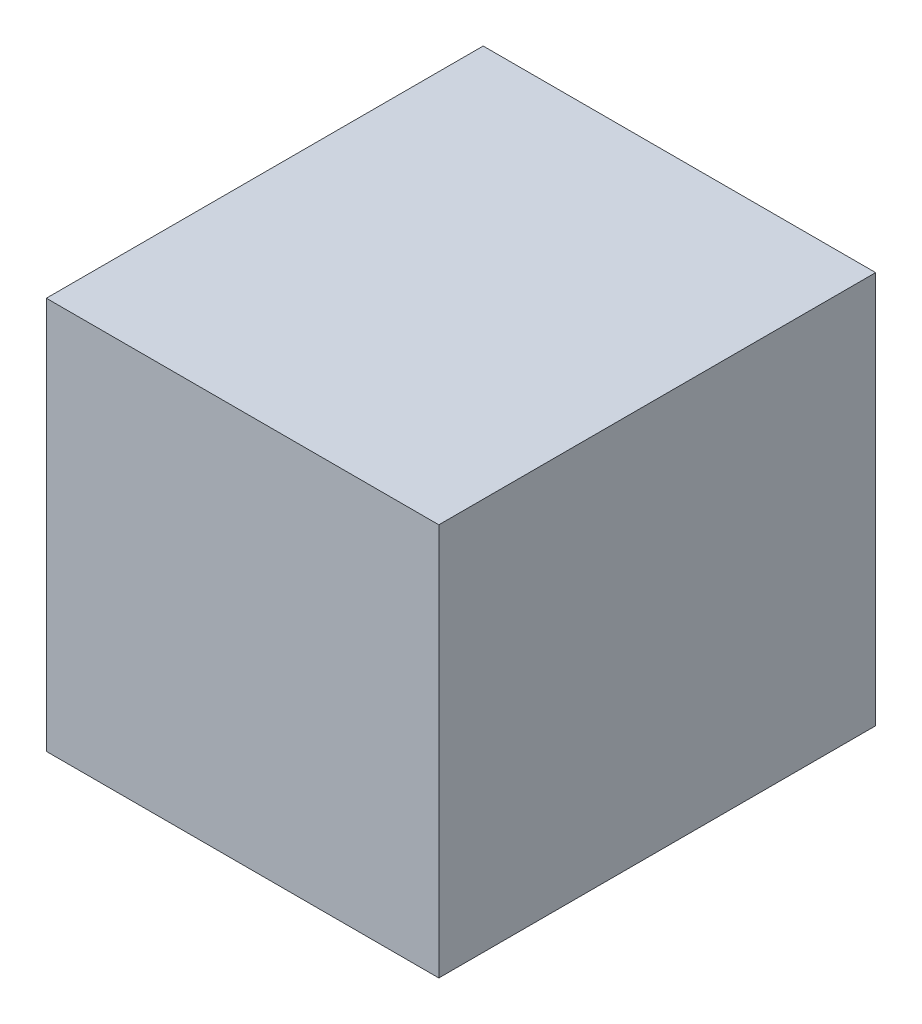
ISO-10303-21;
HEADER;
FILE_DESCRIPTION(('STEP AP214'),'2;1');
FILE_NAME('part.step','',(''),(''),'','','');
FILE_SCHEMA(('AUTOMOTIVE_DESIGN { 1 0 10303 214 1 1 1 1 }'));
ENDSEC;
DATA;
#1=APPLICATION_CONTEXT('core data for automotive mechanical design processes');
#2=APPLICATION_PROTOCOL_DEFINITION('international standard','automotive_design',2000,#1);
#3=PRODUCT_CONTEXT('',#1,'mechanical');
#4=PRODUCT('Part','Part','',(#3));
#5=PRODUCT_RELATED_PRODUCT_CATEGORY('part','',(#4));
#6=PRODUCT_DEFINITION_FORMATION('','',#4);
#7=PRODUCT_DEFINITION_CONTEXT('part definition',#1,'design');
#8=PRODUCT_DEFINITION('design','',#6,#7);
#9=PRODUCT_DEFINITION_SHAPE('','',#8);
#10=(LENGTH_UNIT() NAMED_UNIT(*) SI_UNIT(.MILLI.,.METRE.));
#11=(NAMED_UNIT(*) PLANE_ANGLE_UNIT() SI_UNIT($,.RADIAN.));
#12=(NAMED_UNIT(*) SI_UNIT($,.STERADIAN.) SOLID_ANGLE_UNIT());
#13=UNCERTAINTY_MEASURE_WITH_UNIT(LENGTH_MEASURE(1.E-05),#10,'distance_accuracy_value','');
#14=(GEOMETRIC_REPRESENTATION_CONTEXT(3) GLOBAL_UNCERTAINTY_ASSIGNED_CONTEXT((#13)) GLOBAL_UNIT_ASSIGNED_CONTEXT((#10,
#11,#12)) REPRESENTATION_CONTEXT('',''));
#15=CARTESIAN_POINT('',(0.,0.,0.));
#16=DIRECTION('',(0.,0.,1.));
#17=DIRECTION('',(1.,0.,0.));
#18=AXIS2_PLACEMENT_3D('',#15,#16,#17);
#19=CARTESIAN_POINT('',(44.958,-44.958,100.076));
#20=DIRECTION('',(-1.,0.,0.));
#21=DIRECTION('',(0.,0.,1.));
#22=AXIS2_PLACEMENT_3D('',#19,#20,#21);
#23=PLANE('',#22);
#24=DIRECTION('',(0.,1.,0.));
#25=VECTOR('',#24,1.);
#26=CARTESIAN_POINT('',(44.958,-44.958,0.));
#27=LINE('',#26,#25);
#28=CARTESIAN_POINT('',(44.958,-44.958,0.));
#29=VERTEX_POINT('',#28);
#30=CARTESIAN_POINT('',(44.958,44.958,0.));
#31=VERTEX_POINT('',#30);
#32=EDGE_CURVE('E105',#29,#31,#27,.T.);
#33=ORIENTED_EDGE('',*,*,#32,.T.);
#34=DIRECTION('',(0.,0.,-1.));
#35=VECTOR('',#34,1.);
#36=CARTESIAN_POINT('',(44.958,44.958,100.076));
#37=LINE('',#36,#35);
#38=CARTESIAN_POINT('',(44.958,44.958,100.076));
#39=VERTEX_POINT('',#38);
#40=EDGE_CURVE('E11',#39,#31,#37,.T.);
#41=ORIENTED_EDGE('',*,*,#40,.F.);
#42=DIRECTION('',(0.,1.,0.));
#43=VECTOR('',#42,1.);
#44=CARTESIAN_POINT('',(44.958,-44.958,100.076));
#45=LINE('',#44,#43);
#46=CARTESIAN_POINT('',(44.958,-44.958,100.076));
#47=VERTEX_POINT('',#46);
#48=EDGE_CURVE('E93',#47,#39,#45,.T.);
#49=ORIENTED_EDGE('',*,*,#48,.F.);
#50=DIRECTION('',(0.,0.,-1.));
#51=VECTOR('',#50,1.);
#52=CARTESIAN_POINT('',(44.958,-44.958,100.076));
#53=LINE('',#52,#51);
#54=EDGE_CURVE('E101',#47,#29,#53,.T.);
#55=ORIENTED_EDGE('',*,*,#54,.T.);
#56=EDGE_LOOP('',(#33,#41,#49,#55));
#57=FACE_BOUND('',#56,.T.);
#58=ADVANCED_FACE('F42',(#57),#23,.F.);
#59=CARTESIAN_POINT('',(-44.958,44.958,100.076));
#60=DIRECTION('',(0.,-1.,0.));
#61=DIRECTION('',(0.,0.,-1.));
#62=AXIS2_PLACEMENT_3D('',#59,#60,#61);
#63=PLANE('',#62);
#64=DIRECTION('',(-1.,0.,0.));
#65=VECTOR('',#64,1.);
#66=CARTESIAN_POINT('',(-44.958,44.958,0.));
#67=LINE('',#66,#65);
#68=CARTESIAN_POINT('',(-44.958,44.958,0.));
#69=VERTEX_POINT('',#68);
#70=EDGE_CURVE('E97',#31,#69,#67,.T.);
#71=ORIENTED_EDGE('',*,*,#70,.T.);
#72=DIRECTION('',(0.,0.,-1.));
#73=VECTOR('',#72,1.);
#74=CARTESIAN_POINT('',(-44.958,44.958,100.076));
#75=LINE('',#74,#73);
#76=CARTESIAN_POINT('',(-44.958,44.958,100.076));
#77=VERTEX_POINT('',#76);
#78=EDGE_CURVE('E50',#77,#69,#75,.T.);
#79=ORIENTED_EDGE('',*,*,#78,.F.);
#80=DIRECTION('',(-1.,0.,0.));
#81=VECTOR('',#80,1.);
#82=CARTESIAN_POINT('',(-44.958,44.958,100.076));
#83=LINE('',#82,#81);
#84=EDGE_CURVE('E88',#39,#77,#83,.T.);
#85=ORIENTED_EDGE('',*,*,#84,.F.);
#86=ORIENTED_EDGE('',*,*,#40,.T.);
#87=EDGE_LOOP('',(#71,#79,#85,#86));
#88=FACE_BOUND('',#87,.T.);
#89=ADVANCED_FACE('F96',(#88),#63,.F.);
#90=CARTESIAN_POINT('',(-44.958,-44.958,100.076));
#91=DIRECTION('',(1.,0.,0.));
#92=DIRECTION('',(0.,0.,-1.));
#93=AXIS2_PLACEMENT_3D('',#90,#91,#92);
#94=PLANE('',#93);
#95=DIRECTION('',(0.,-1.,0.));
#96=VECTOR('',#95,1.);
#97=CARTESIAN_POINT('',(-44.958,-44.958,0.));
#98=LINE('',#97,#96);
#99=CARTESIAN_POINT('',(-44.958,-44.958,0.));
#100=VERTEX_POINT('',#99);
#101=EDGE_CURVE('E75',#69,#100,#98,.T.);
#102=ORIENTED_EDGE('',*,*,#101,.T.);
#103=DIRECTION('',(0.,0.,-1.));
#104=VECTOR('',#103,1.);
#105=CARTESIAN_POINT('',(-44.958,-44.958,100.076));
#106=LINE('',#105,#104);
#107=CARTESIAN_POINT('',(-44.958,-44.958,100.076));
#108=VERTEX_POINT('',#107);
#109=EDGE_CURVE('E98',#108,#100,#106,.T.);
#110=ORIENTED_EDGE('',*,*,#109,.F.);
#111=DIRECTION('',(0.,-1.,0.));
#112=VECTOR('',#111,1.);
#113=CARTESIAN_POINT('',(-44.958,-44.958,100.076));
#114=LINE('',#113,#112);
#115=EDGE_CURVE('E91',#77,#108,#114,.T.);
#116=ORIENTED_EDGE('',*,*,#115,.F.);
#117=ORIENTED_EDGE('',*,*,#78,.T.);
#118=EDGE_LOOP('',(#102,#110,#116,#117));
#119=FACE_BOUND('',#118,.T.);
#120=ADVANCED_FACE('F99',(#119),#94,.F.);
#121=CARTESIAN_POINT('',(-44.958,-44.958,100.076));
#122=DIRECTION('',(0.,1.,0.));
#123=DIRECTION('',(0.,0.,1.));
#124=AXIS2_PLACEMENT_3D('',#121,#122,#123);
#125=PLANE('',#124);
#126=DIRECTION('',(1.,0.,0.));
#127=VECTOR('',#126,1.);
#128=CARTESIAN_POINT('',(-44.958,-44.958,0.));
#129=LINE('',#128,#127);
#130=EDGE_CURVE('E81',#100,#29,#129,.T.);
#131=ORIENTED_EDGE('',*,*,#130,.T.);
#132=ORIENTED_EDGE('',*,*,#54,.F.);
#133=DIRECTION('',(1.,0.,0.));
#134=VECTOR('',#133,1.);
#135=CARTESIAN_POINT('',(-44.958,-44.958,100.076));
#136=LINE('',#135,#134);
#137=EDGE_CURVE('E58',#108,#47,#136,.T.);
#138=ORIENTED_EDGE('',*,*,#137,.F.);
#139=ORIENTED_EDGE('',*,*,#109,.T.);
#140=EDGE_LOOP('',(#131,#132,#138,#139));
#141=FACE_BOUND('',#140,.T.);
#142=ADVANCED_FACE('F112',(#141),#125,.F.);
#143=CARTESIAN_POINT('',(0.,0.,100.076));
#144=DIRECTION('',(0.,0.,-1.));
#145=DIRECTION('',(-1.,0.,0.));
#146=AXIS2_PLACEMENT_3D('',#143,#144,#145);
#147=PLANE('',#146);
#148=ORIENTED_EDGE('',*,*,#48,.T.);
#149=ORIENTED_EDGE('',*,*,#84,.T.);
#150=ORIENTED_EDGE('',*,*,#115,.T.);
#151=ORIENTED_EDGE('',*,*,#137,.T.);
#152=EDGE_LOOP('',(#148,#149,#150,#151));
#153=FACE_BOUND('',#152,.T.);
#154=ADVANCED_FACE('F89',(#153),#147,.F.);
#155=CARTESIAN_POINT('',(0.,0.,0.));
#156=DIRECTION('',(0.,0.,-1.));
#157=DIRECTION('',(-1.,0.,0.));
#158=AXIS2_PLACEMENT_3D('',#155,#156,#157);
#159=PLANE('',#158);
#160=ORIENTED_EDGE('',*,*,#32,.F.);
#161=ORIENTED_EDGE('',*,*,#130,.F.);
#162=ORIENTED_EDGE('',*,*,#101,.F.);
#163=ORIENTED_EDGE('',*,*,#70,.F.);
#164=EDGE_LOOP('',(#160,#161,#162,#163));
#165=FACE_BOUND('',#164,.T.);
#166=ADVANCED_FACE('F115',(#165),#159,.T.);
#167=CLOSED_SHELL('',(#58,#89,#120,#142,#154,#166));
#168=MANIFOLD_SOLID_BREP('B2',#167);
#169=ADVANCED_BREP_SHAPE_REPRESENTATION('',(#18,#168),#14);
#170=SHAPE_DEFINITION_REPRESENTATION(#9,#169);
ENDSEC;
END-ISO-10303-21;
